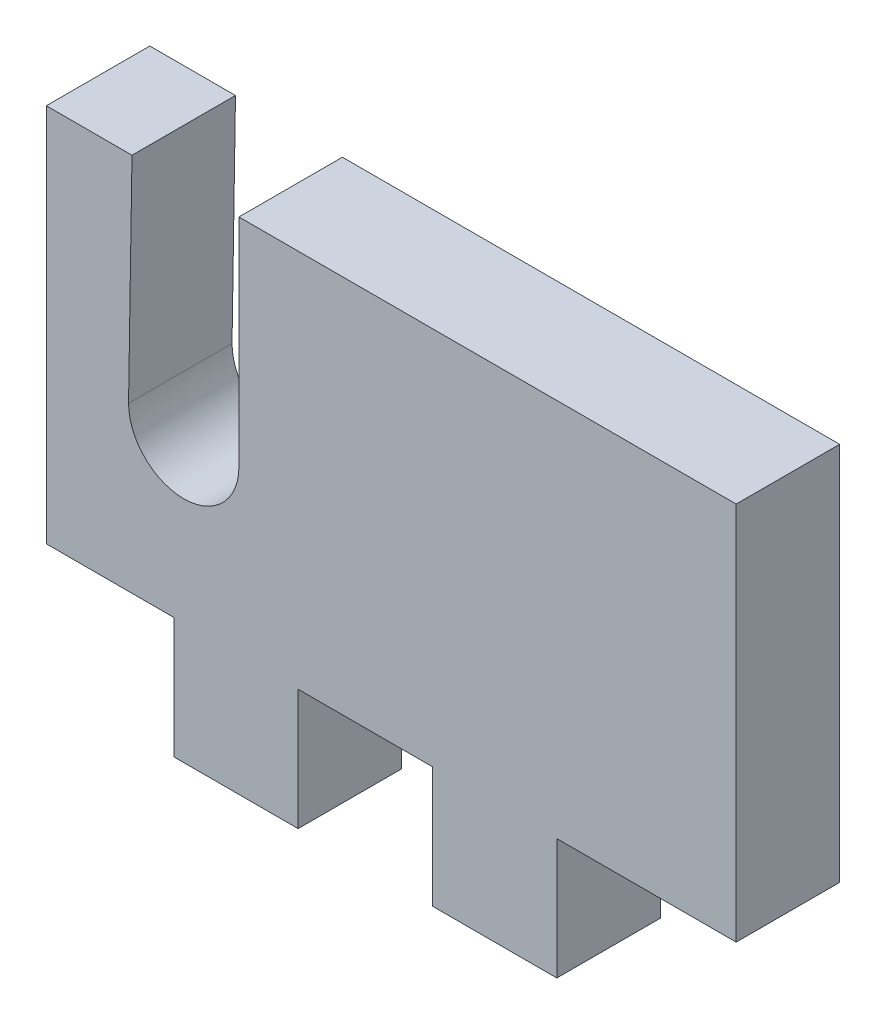
ISO-10303-21;
HEADER;
FILE_DESCRIPTION(('STEP AP214'),'2;1');
FILE_NAME('part.step','',(''),(''),'','','');
FILE_SCHEMA(('AUTOMOTIVE_DESIGN { 1 0 10303 214 1 1 1 1 }'));
ENDSEC;
DATA;
#1=APPLICATION_CONTEXT('core data for automotive mechanical design processes');
#2=APPLICATION_PROTOCOL_DEFINITION('international standard','automotive_design',2000,#1);
#3=PRODUCT_CONTEXT('',#1,'mechanical');
#4=PRODUCT('Part','Part','',(#3));
#5=PRODUCT_RELATED_PRODUCT_CATEGORY('part','',(#4));
#6=PRODUCT_DEFINITION_FORMATION('','',#4);
#7=PRODUCT_DEFINITION_CONTEXT('part definition',#1,'design');
#8=PRODUCT_DEFINITION('design','',#6,#7);
#9=PRODUCT_DEFINITION_SHAPE('','',#8);
#10=(LENGTH_UNIT() NAMED_UNIT(*) SI_UNIT(.MILLI.,.METRE.));
#11=(NAMED_UNIT(*) PLANE_ANGLE_UNIT() SI_UNIT($,.RADIAN.));
#12=(NAMED_UNIT(*) SI_UNIT($,.STERADIAN.) SOLID_ANGLE_UNIT());
#13=UNCERTAINTY_MEASURE_WITH_UNIT(LENGTH_MEASURE(1.E-05),#10,'distance_accuracy_value','');
#14=(GEOMETRIC_REPRESENTATION_CONTEXT(3) GLOBAL_UNCERTAINTY_ASSIGNED_CONTEXT((#13)) GLOBAL_UNIT_ASSIGNED_CONTEXT((#10,
#11,#12)) REPRESENTATION_CONTEXT('',''));
#15=CARTESIAN_POINT('',(0.,0.,0.));
#16=DIRECTION('',(0.,0.,1.));
#17=DIRECTION('',(1.,0.,0.));
#18=AXIS2_PLACEMENT_3D('',#15,#16,#17);
#19=CARTESIAN_POINT('',(-7.8838174273859,4.33402489626557,3.));
#20=DIRECTION('',(0.,-1.,0.));
#21=DIRECTION('',(0.,0.,-1.));
#22=AXIS2_PLACEMENT_3D('',#19,#20,#21);
#23=PLANE('',#22);
#24=DIRECTION('',(-1.,0.,0.));
#25=VECTOR('',#24,1.);
#26=CARTESIAN_POINT('',(-7.8838174273859,4.33402489626557,0.));
#27=LINE('',#26,#25);
#28=CARTESIAN_POINT('',(12.1161825726141,4.33402489626557,0.));
#29=VERTEX_POINT('',#28);
#30=CARTESIAN_POINT('',(-2.30010183619864,4.33402489626557,0.));
#31=VERTEX_POINT('',#30);
#32=EDGE_CURVE('E253',#29,#31,#27,.T.);
#33=ORIENTED_EDGE('',*,*,#32,.T.);
#34=DIRECTION('',(0.,0.,1.));
#35=VECTOR('',#34,1.);
#36=CARTESIAN_POINT('',(-2.30010183619864,4.33402489626557,0.));
#37=LINE('',#36,#35);
#38=CARTESIAN_POINT('',(-2.30010183619864,4.33402489626557,3.));
#39=VERTEX_POINT('',#38);
#40=EDGE_CURVE('E185',#31,#39,#37,.T.);
#41=ORIENTED_EDGE('',*,*,#40,.T.);
#42=DIRECTION('',(-1.,0.,0.));
#43=VECTOR('',#42,1.);
#44=CARTESIAN_POINT('',(-7.8838174273859,4.33402489626557,3.));
#45=LINE('',#44,#43);
#46=CARTESIAN_POINT('',(12.1161825726141,4.33402489626557,3.));
#47=VERTEX_POINT('',#46);
#48=EDGE_CURVE('E260',#47,#39,#45,.T.);
#49=ORIENTED_EDGE('',*,*,#48,.F.);
#50=DIRECTION('',(0.,0.,-1.));
#51=VECTOR('',#50,1.);
#52=CARTESIAN_POINT('',(12.1161825726141,4.33402489626557,3.));
#53=LINE('',#52,#51);
#54=EDGE_CURVE('E11',#47,#29,#53,.T.);
#55=ORIENTED_EDGE('',*,*,#54,.T.);
#56=EDGE_LOOP('',(#33,#41,#49,#55));
#57=FACE_BOUND('',#56,.T.);
#58=ADVANCED_FACE('F39',(#57),#23,.F.);
#59=CARTESIAN_POINT('',(-7.8838174273859,-10.1659751037344,3.));
#60=DIRECTION('',(0.,1.,0.));
#61=DIRECTION('',(0.,0.,1.));
#62=AXIS2_PLACEMENT_3D('',#59,#60,#61);
#63=PLANE('',#62);
#64=DIRECTION('',(1.,0.,0.));
#65=VECTOR('',#64,1.);
#66=CARTESIAN_POINT('',(-7.8838174273859,-10.1659751037344,3.));
#67=LINE('',#66,#65);
#68=CARTESIAN_POINT('',(-4.1838174273859,-10.1659751037344,3.));
#69=VERTEX_POINT('',#68);
#70=CARTESIAN_POINT('',(-0.583817427385895,-10.1659751037344,3.));
#71=VERTEX_POINT('',#70);
#72=EDGE_CURVE('E256',#69,#71,#67,.T.);
#73=ORIENTED_EDGE('',*,*,#72,.F.);
#74=DIRECTION('',(0.,0.,1.));
#75=VECTOR('',#74,1.);
#76=CARTESIAN_POINT('',(-4.1838174273859,-10.1659751037344,0.));
#77=LINE('',#76,#75);
#78=CARTESIAN_POINT('',(-4.1838174273859,-10.1659751037344,0.));
#79=VERTEX_POINT('',#78);
#80=EDGE_CURVE('E196',#79,#69,#77,.T.);
#81=ORIENTED_EDGE('',*,*,#80,.F.);
#82=DIRECTION('',(1.,0.,0.));
#83=VECTOR('',#82,1.);
#84=CARTESIAN_POINT('',(-7.8838174273859,-10.1659751037344,0.));
#85=LINE('',#84,#83);
#86=CARTESIAN_POINT('',(-0.583817427385895,-10.1659751037344,0.));
#87=VERTEX_POINT('',#86);
#88=EDGE_CURVE('E268',#79,#87,#85,.T.);
#89=ORIENTED_EDGE('',*,*,#88,.T.);
#90=DIRECTION('',(0.,0.,1.));
#91=VECTOR('',#90,1.);
#92=CARTESIAN_POINT('',(-0.583817427385895,-10.1659751037344,0.));
#93=LINE('',#92,#91);
#94=EDGE_CURVE('E209',#87,#71,#93,.T.);
#95=ORIENTED_EDGE('',*,*,#94,.T.);
#96=EDGE_LOOP('',(#73,#81,#89,#95));
#97=FACE_BOUND('',#96,.T.);
#98=ADVANCED_FACE('F286',(#97),#63,.F.);
#99=CARTESIAN_POINT('',(-7.8838174273859,4.33402489626557,3.));
#100=DIRECTION('',(1.,0.,0.));
#101=DIRECTION('',(0.,1.,0.));
#102=AXIS2_PLACEMENT_3D('',#99,#100,#101);
#103=PLANE('',#102);
#104=DIRECTION('',(0.,-1.,0.));
#105=VECTOR('',#104,1.);
#106=CARTESIAN_POINT('',(-7.8838174273859,4.33402489626557,0.));
#107=LINE('',#106,#105);
#108=CARTESIAN_POINT('',(-7.8838174273859,4.33402489626557,0.));
#109=VERTEX_POINT('',#108);
#110=CARTESIAN_POINT('',(-7.8838174273859,-6.66597510373444,0.));
#111=VERTEX_POINT('',#110);
#112=EDGE_CURVE('E205',#109,#111,#107,.T.);
#113=ORIENTED_EDGE('',*,*,#112,.T.);
#114=DIRECTION('',(0.,0.,1.));
#115=VECTOR('',#114,1.);
#116=CARTESIAN_POINT('',(-7.8838174273859,-6.66597510373444,0.));
#117=LINE('',#116,#115);
#118=CARTESIAN_POINT('',(-7.8838174273859,-6.66597510373444,3.));
#119=VERTEX_POINT('',#118);
#120=EDGE_CURVE('E202',#111,#119,#117,.T.);
#121=ORIENTED_EDGE('',*,*,#120,.T.);
#122=DIRECTION('',(0.,-1.,0.));
#123=VECTOR('',#122,1.);
#124=CARTESIAN_POINT('',(-7.8838174273859,4.33402489626557,3.));
#125=LINE('',#124,#123);
#126=CARTESIAN_POINT('',(-7.8838174273859,4.33402489626557,3.));
#127=VERTEX_POINT('',#126);
#128=EDGE_CURVE('E249',#127,#119,#125,.T.);
#129=ORIENTED_EDGE('',*,*,#128,.F.);
#130=DIRECTION('',(0.,0.,-1.));
#131=VECTOR('',#130,1.);
#132=CARTESIAN_POINT('',(-7.8838174273859,4.33402489626557,3.));
#133=LINE('',#132,#131);
#134=EDGE_CURVE('E47',#127,#109,#133,.T.);
#135=ORIENTED_EDGE('',*,*,#134,.T.);
#136=EDGE_LOOP('',(#113,#121,#129,#135));
#137=FACE_BOUND('',#136,.T.);
#138=ADVANCED_FACE('F41',(#137),#103,.F.);
#139=CARTESIAN_POINT('',(3.3161825726141,-10.1659751037344,3.));
#140=VERTEX_POINT('',#139);
#141=CARTESIAN_POINT('',(6.9161825726141,-10.1659751037344,3.));
#142=VERTEX_POINT('',#141);
#143=EDGE_CURVE('E252',#140,#142,#67,.T.);
#144=ORIENTED_EDGE('',*,*,#143,.F.);
#145=DIRECTION('',(0.,0.,1.));
#146=VECTOR('',#145,1.);
#147=CARTESIAN_POINT('',(3.3161825726141,-10.1659751037344,0.));
#148=LINE('',#147,#146);
#149=CARTESIAN_POINT('',(3.3161825726141,-10.1659751037344,0.));
#150=VERTEX_POINT('',#149);
#151=EDGE_CURVE('E212',#150,#140,#148,.T.);
#152=ORIENTED_EDGE('',*,*,#151,.F.);
#153=CARTESIAN_POINT('',(6.9161825726141,-10.1659751037344,0.));
#154=VERTEX_POINT('',#153);
#155=EDGE_CURVE('E265',#150,#154,#85,.T.);
#156=ORIENTED_EDGE('',*,*,#155,.T.);
#157=DIRECTION('',(0.,0.,1.));
#158=VECTOR('',#157,1.);
#159=CARTESIAN_POINT('',(6.9161825726141,-10.1659751037344,0.));
#160=LINE('',#159,#158);
#161=EDGE_CURVE('E233',#154,#142,#160,.T.);
#162=ORIENTED_EDGE('',*,*,#161,.T.);
#163=EDGE_LOOP('',(#144,#152,#156,#162));
#164=FACE_BOUND('',#163,.T.);
#165=ADVANCED_FACE('F314',(#164),#63,.F.);
#166=CARTESIAN_POINT('',(12.1161825726141,4.33402489626557,3.));
#167=DIRECTION('',(-1.,0.,0.));
#168=DIRECTION('',(0.,-1.,0.));
#169=AXIS2_PLACEMENT_3D('',#166,#167,#168);
#170=PLANE('',#169);
#171=DIRECTION('',(0.,1.,0.));
#172=VECTOR('',#171,1.);
#173=CARTESIAN_POINT('',(12.1161825726141,4.33402489626557,3.));
#174=LINE('',#173,#172);
#175=CARTESIAN_POINT('',(12.1161825726141,-6.66597510373444,3.));
#176=VERTEX_POINT('',#175);
#177=EDGE_CURVE('E257',#176,#47,#174,.T.);
#178=ORIENTED_EDGE('',*,*,#177,.F.);
#179=DIRECTION('',(0.,0.,1.));
#180=VECTOR('',#179,1.);
#181=CARTESIAN_POINT('',(12.1161825726141,-6.66597510373444,0.));
#182=LINE('',#181,#180);
#183=CARTESIAN_POINT('',(12.1161825726141,-6.66597510373444,0.));
#184=VERTEX_POINT('',#183);
#185=EDGE_CURVE('E237',#184,#176,#182,.T.);
#186=ORIENTED_EDGE('',*,*,#185,.F.);
#187=DIRECTION('',(0.,1.,0.));
#188=VECTOR('',#187,1.);
#189=CARTESIAN_POINT('',(12.1161825726141,4.33402489626557,0.));
#190=LINE('',#189,#188);
#191=EDGE_CURVE('E269',#184,#29,#190,.T.);
#192=ORIENTED_EDGE('',*,*,#191,.T.);
#193=ORIENTED_EDGE('',*,*,#54,.F.);
#194=EDGE_LOOP('',(#178,#186,#192,#193));
#195=FACE_BOUND('',#194,.T.);
#196=ADVANCED_FACE('F318',(#195),#170,.F.);
#197=CARTESIAN_POINT('',(-5.40010183619864,4.33402489626557,3.));
#198=VERTEX_POINT('',#197);
#199=EDGE_CURVE('E259',#198,#127,#45,.T.);
#200=ORIENTED_EDGE('',*,*,#199,.F.);
#201=DIRECTION('',(0.,0.,1.));
#202=VECTOR('',#201,1.);
#203=CARTESIAN_POINT('',(-5.40010183619864,4.33402489626557,0.));
#204=LINE('',#203,#202);
#205=CARTESIAN_POINT('',(-5.40010183619864,4.33402489626557,0.));
#206=VERTEX_POINT('',#205);
#207=EDGE_CURVE('E183',#206,#198,#204,.T.);
#208=ORIENTED_EDGE('',*,*,#207,.F.);
#209=EDGE_CURVE('E175',#206,#109,#27,.T.);
#210=ORIENTED_EDGE('',*,*,#209,.T.);
#211=ORIENTED_EDGE('',*,*,#134,.F.);
#212=EDGE_LOOP('',(#200,#208,#210,#211));
#213=FACE_BOUND('',#212,.T.);
#214=ADVANCED_FACE('F310',(#213),#23,.F.);
#215=CARTESIAN_POINT('',(0.,0.,3.));
#216=DIRECTION('',(0.,0.,1.));
#217=DIRECTION('',(1.,0.,0.));
#218=AXIS2_PLACEMENT_3D('',#215,#216,#217);
#219=PLANE('',#218);
#220=CARTESIAN_POINT('',(-3.90010183619864,-1.9416604081488,3.));
#221=DIRECTION('',(0.,0.,1.));
#222=DIRECTION('',(1.,0.,0.));
#223=AXIS2_PLACEMENT_3D('',#220,#221,#222);
#224=CIRCLE('',#223,1.60000378724346);
#225=CARTESIAN_POINT('',(-5.50010183619864,-1.94514167134186,3.));
#226=VERTEX_POINT('',#225);
#227=CARTESIAN_POINT('',(-2.30010183619864,-1.93817914495575,3.));
#228=VERTEX_POINT('',#227);
#229=EDGE_CURVE('E176',#226,#228,#224,.T.);
#230=ORIENTED_EDGE('',*,*,#229,.F.);
#231=DIRECTION('',(-0.015923661200951,-0.999873210469186,0.));
#232=VECTOR('',#231,1.);
#233=CARTESIAN_POINT('',(-5.40010183619864,4.33402489626557,3.));
#234=LINE('',#233,#232);
#235=EDGE_CURVE('E158',#198,#226,#234,.T.);
#236=ORIENTED_EDGE('',*,*,#235,.F.);
#237=ORIENTED_EDGE('',*,*,#199,.T.);
#238=ORIENTED_EDGE('',*,*,#128,.T.);
#239=DIRECTION('',(-1.,0.,0.));
#240=VECTOR('',#239,1.);
#241=CARTESIAN_POINT('',(-7.8838174273859,-6.66597510373444,3.));
#242=LINE('',#241,#240);
#243=CARTESIAN_POINT('',(-4.1838174273859,-6.66597510373444,3.));
#244=VERTEX_POINT('',#243);
#245=EDGE_CURVE('E194',#244,#119,#242,.T.);
#246=ORIENTED_EDGE('',*,*,#245,.F.);
#247=DIRECTION('',(0.,1.,0.));
#248=VECTOR('',#247,1.);
#249=CARTESIAN_POINT('',(-4.1838174273859,-10.1659751037344,3.));
#250=LINE('',#249,#248);
#251=EDGE_CURVE('E197',#69,#244,#250,.T.);
#252=ORIENTED_EDGE('',*,*,#251,.F.);
#253=ORIENTED_EDGE('',*,*,#72,.T.);
#254=DIRECTION('',(0.,-1.,0.));
#255=VECTOR('',#254,1.);
#256=CARTESIAN_POINT('',(-0.583817427385895,-10.1659751037344,3.));
#257=LINE('',#256,#255);
#258=CARTESIAN_POINT('',(-0.583817427385895,-6.66597510373444,3.));
#259=VERTEX_POINT('',#258);
#260=EDGE_CURVE('E200',#259,#71,#257,.T.);
#261=ORIENTED_EDGE('',*,*,#260,.F.);
#262=DIRECTION('',(-1.,0.,0.));
#263=VECTOR('',#262,1.);
#264=CARTESIAN_POINT('',(-0.583817427385895,-6.66597510373444,3.));
#265=LINE('',#264,#263);
#266=CARTESIAN_POINT('',(3.3161825726141,-6.66597510373444,3.));
#267=VERTEX_POINT('',#266);
#268=EDGE_CURVE('E219',#267,#259,#265,.T.);
#269=ORIENTED_EDGE('',*,*,#268,.F.);
#270=DIRECTION('',(0.,1.,0.));
#271=VECTOR('',#270,1.);
#272=CARTESIAN_POINT('',(3.3161825726141,-10.1659751037344,3.));
#273=LINE('',#272,#271);
#274=EDGE_CURVE('E222',#140,#267,#273,.T.);
#275=ORIENTED_EDGE('',*,*,#274,.F.);
#276=ORIENTED_EDGE('',*,*,#143,.T.);
#277=DIRECTION('',(0.,-1.,0.));
#278=VECTOR('',#277,1.);
#279=CARTESIAN_POINT('',(6.9161825726141,-10.1659751037344,3.));
#280=LINE('',#279,#278);
#281=CARTESIAN_POINT('',(6.9161825726141,-6.66597510373444,3.));
#282=VERTEX_POINT('',#281);
#283=EDGE_CURVE('E218',#282,#142,#280,.T.);
#284=ORIENTED_EDGE('',*,*,#283,.F.);
#285=DIRECTION('',(-1.,0.,0.));
#286=VECTOR('',#285,1.);
#287=CARTESIAN_POINT('',(6.9161825726141,-6.66597510373444,3.));
#288=LINE('',#287,#286);
#289=EDGE_CURVE('E240',#176,#282,#288,.T.);
#290=ORIENTED_EDGE('',*,*,#289,.F.);
#291=ORIENTED_EDGE('',*,*,#177,.T.);
#292=ORIENTED_EDGE('',*,*,#48,.T.);
#293=DIRECTION('',(0.,1.,0.));
#294=VECTOR('',#293,1.);
#295=CARTESIAN_POINT('',(-2.30010183619864,4.33402489626557,3.));
#296=LINE('',#295,#294);
#297=EDGE_CURVE('E161',#228,#39,#296,.T.);
#298=ORIENTED_EDGE('',*,*,#297,.F.);
#299=EDGE_LOOP('',(#230,#236,#237,#238,#246,#252,#253,#261,#269,#275,#276,#284,#290,#291,#292,#298));
#300=FACE_BOUND('',#299,.T.);
#301=ADVANCED_FACE('F290',(#300),#219,.T.);
#302=CARTESIAN_POINT('',(0.,0.,0.));
#303=DIRECTION('',(0.,0.,1.));
#304=DIRECTION('',(1.,0.,0.));
#305=AXIS2_PLACEMENT_3D('',#302,#303,#304);
#306=PLANE('',#305);
#307=DIRECTION('',(-0.015923661200951,-0.999873210469186,0.));
#308=VECTOR('',#307,1.);
#309=CARTESIAN_POINT('',(-5.40010183619864,4.33402489626557,0.));
#310=LINE('',#309,#308);
#311=CARTESIAN_POINT('',(-5.50010183619864,-1.94514167134186,0.));
#312=VERTEX_POINT('',#311);
#313=EDGE_CURVE('E155',#206,#312,#310,.T.);
#314=ORIENTED_EDGE('',*,*,#313,.T.);
#315=CARTESIAN_POINT('',(-3.90010183619864,-1.9416604081488,0.));
#316=DIRECTION('',(0.,0.,1.));
#317=DIRECTION('',(1.,0.,0.));
#318=AXIS2_PLACEMENT_3D('',#315,#316,#317);
#319=CIRCLE('',#318,1.60000378724346);
#320=CARTESIAN_POINT('',(-2.30010183619864,-1.93817914495575,0.));
#321=VERTEX_POINT('',#320);
#322=EDGE_CURVE('E162',#312,#321,#319,.T.);
#323=ORIENTED_EDGE('',*,*,#322,.T.);
#324=DIRECTION('',(0.,1.,0.));
#325=VECTOR('',#324,1.);
#326=CARTESIAN_POINT('',(-2.30010183619864,4.33402489626557,0.));
#327=LINE('',#326,#325);
#328=EDGE_CURVE('E181',#321,#31,#327,.T.);
#329=ORIENTED_EDGE('',*,*,#328,.T.);
#330=ORIENTED_EDGE('',*,*,#32,.F.);
#331=ORIENTED_EDGE('',*,*,#191,.F.);
#332=DIRECTION('',(-1.,0.,0.));
#333=VECTOR('',#332,1.);
#334=CARTESIAN_POINT('',(6.9161825726141,-6.66597510373444,0.));
#335=LINE('',#334,#333);
#336=CARTESIAN_POINT('',(6.9161825726141,-6.66597510373444,0.));
#337=VERTEX_POINT('',#336);
#338=EDGE_CURVE('E236',#184,#337,#335,.T.);
#339=ORIENTED_EDGE('',*,*,#338,.T.);
#340=DIRECTION('',(0.,-1.,0.));
#341=VECTOR('',#340,1.);
#342=CARTESIAN_POINT('',(6.9161825726141,-10.1659751037344,0.));
#343=LINE('',#342,#341);
#344=EDGE_CURVE('E243',#337,#154,#343,.T.);
#345=ORIENTED_EDGE('',*,*,#344,.T.);
#346=ORIENTED_EDGE('',*,*,#155,.F.);
#347=DIRECTION('',(0.,1.,0.));
#348=VECTOR('',#347,1.);
#349=CARTESIAN_POINT('',(3.3161825726141,-10.1659751037344,0.));
#350=LINE('',#349,#348);
#351=CARTESIAN_POINT('',(3.3161825726141,-6.66597510373444,0.));
#352=VERTEX_POINT('',#351);
#353=EDGE_CURVE('E228',#150,#352,#350,.T.);
#354=ORIENTED_EDGE('',*,*,#353,.T.);
#355=DIRECTION('',(-1.,0.,0.));
#356=VECTOR('',#355,1.);
#357=CARTESIAN_POINT('',(-0.583817427385895,-6.66597510373444,0.));
#358=LINE('',#357,#356);
#359=CARTESIAN_POINT('',(-0.583817427385895,-6.66597510373444,0.));
#360=VERTEX_POINT('',#359);
#361=EDGE_CURVE('E62',#352,#360,#358,.T.);
#362=ORIENTED_EDGE('',*,*,#361,.T.);
#363=DIRECTION('',(0.,-1.,0.));
#364=VECTOR('',#363,1.);
#365=CARTESIAN_POINT('',(-0.583817427385895,-10.1659751037344,0.));
#366=LINE('',#365,#364);
#367=EDGE_CURVE('E223',#360,#87,#366,.T.);
#368=ORIENTED_EDGE('',*,*,#367,.T.);
#369=ORIENTED_EDGE('',*,*,#88,.F.);
#370=DIRECTION('',(0.,1.,0.));
#371=VECTOR('',#370,1.);
#372=CARTESIAN_POINT('',(-4.1838174273859,-10.1659751037344,0.));
#373=LINE('',#372,#371);
#374=CARTESIAN_POINT('',(-4.1838174273859,-6.66597510373444,0.));
#375=VERTEX_POINT('',#374);
#376=EDGE_CURVE('E191',#79,#375,#373,.T.);
#377=ORIENTED_EDGE('',*,*,#376,.T.);
#378=DIRECTION('',(-1.,0.,0.));
#379=VECTOR('',#378,1.);
#380=CARTESIAN_POINT('',(-7.8838174273859,-6.66597510373444,0.));
#381=LINE('',#380,#379);
#382=EDGE_CURVE('E54',#375,#111,#381,.T.);
#383=ORIENTED_EDGE('',*,*,#382,.T.);
#384=ORIENTED_EDGE('',*,*,#112,.F.);
#385=ORIENTED_EDGE('',*,*,#209,.F.);
#386=EDGE_LOOP('',(#314,#323,#329,#330,#331,#339,#345,#346,#354,#362,#368,#369,#377,#383,#384,#385));
#387=FACE_BOUND('',#386,.T.);
#388=ADVANCED_FACE('F173',(#387),#306,.F.);
#389=CARTESIAN_POINT('',(6.9161825726141,-10.1659751037344,0.));
#390=DIRECTION('',(-1.,0.,0.));
#391=DIRECTION('',(0.,0.,1.));
#392=AXIS2_PLACEMENT_3D('',#389,#390,#391);
#393=PLANE('',#392);
#394=ORIENTED_EDGE('',*,*,#283,.T.);
#395=ORIENTED_EDGE('',*,*,#161,.F.);
#396=ORIENTED_EDGE('',*,*,#344,.F.);
#397=DIRECTION('',(0.,0.,1.));
#398=VECTOR('',#397,1.);
#399=CARTESIAN_POINT('',(6.9161825726141,-6.66597510373444,0.));
#400=LINE('',#399,#398);
#401=EDGE_CURVE('E188',#337,#282,#400,.T.);
#402=ORIENTED_EDGE('',*,*,#401,.T.);
#403=EDGE_LOOP('',(#394,#395,#396,#402));
#404=FACE_BOUND('',#403,.T.);
#405=ADVANCED_FACE('F340',(#404),#393,.F.);
#406=CARTESIAN_POINT('',(6.9161825726141,-6.66597510373444,0.));
#407=DIRECTION('',(0.,1.,0.));
#408=DIRECTION('',(0.,0.,1.));
#409=AXIS2_PLACEMENT_3D('',#406,#407,#408);
#410=PLANE('',#409);
#411=ORIENTED_EDGE('',*,*,#289,.T.);
#412=ORIENTED_EDGE('',*,*,#401,.F.);
#413=ORIENTED_EDGE('',*,*,#338,.F.);
#414=ORIENTED_EDGE('',*,*,#185,.T.);
#415=EDGE_LOOP('',(#411,#412,#413,#414));
#416=FACE_BOUND('',#415,.T.);
#417=ADVANCED_FACE('F336',(#416),#410,.F.);
#418=CARTESIAN_POINT('',(-0.583817427385895,-10.1659751037344,0.));
#419=DIRECTION('',(-1.,0.,0.));
#420=DIRECTION('',(0.,0.,1.));
#421=AXIS2_PLACEMENT_3D('',#418,#419,#420);
#422=PLANE('',#421);
#423=ORIENTED_EDGE('',*,*,#260,.T.);
#424=ORIENTED_EDGE('',*,*,#94,.F.);
#425=ORIENTED_EDGE('',*,*,#367,.F.);
#426=DIRECTION('',(0.,0.,1.));
#427=VECTOR('',#426,1.);
#428=CARTESIAN_POINT('',(-0.583817427385895,-6.66597510373444,0.));
#429=LINE('',#428,#427);
#430=EDGE_CURVE('E216',#360,#259,#429,.T.);
#431=ORIENTED_EDGE('',*,*,#430,.T.);
#432=EDGE_LOOP('',(#423,#424,#425,#431));
#433=FACE_BOUND('',#432,.T.);
#434=ADVANCED_FACE('F347',(#433),#422,.F.);
#435=CARTESIAN_POINT('',(-0.583817427385895,-6.66597510373444,0.));
#436=DIRECTION('',(0.,1.,0.));
#437=DIRECTION('',(0.,0.,1.));
#438=AXIS2_PLACEMENT_3D('',#435,#436,#437);
#439=PLANE('',#438);
#440=ORIENTED_EDGE('',*,*,#268,.T.);
#441=ORIENTED_EDGE('',*,*,#430,.F.);
#442=ORIENTED_EDGE('',*,*,#361,.F.);
#443=DIRECTION('',(0.,0.,1.));
#444=VECTOR('',#443,1.);
#445=CARTESIAN_POINT('',(3.3161825726141,-6.66597510373444,0.));
#446=LINE('',#445,#444);
#447=EDGE_CURVE('E214',#352,#267,#446,.T.);
#448=ORIENTED_EDGE('',*,*,#447,.T.);
#449=EDGE_LOOP('',(#440,#441,#442,#448));
#450=FACE_BOUND('',#449,.T.);
#451=ADVANCED_FACE('F303',(#450),#439,.F.);
#452=CARTESIAN_POINT('',(3.3161825726141,-10.1659751037344,0.));
#453=DIRECTION('',(1.,0.,0.));
#454=DIRECTION('',(0.,0.,-1.));
#455=AXIS2_PLACEMENT_3D('',#452,#453,#454);
#456=PLANE('',#455);
#457=ORIENTED_EDGE('',*,*,#274,.T.);
#458=ORIENTED_EDGE('',*,*,#447,.F.);
#459=ORIENTED_EDGE('',*,*,#353,.F.);
#460=ORIENTED_EDGE('',*,*,#151,.T.);
#461=EDGE_LOOP('',(#457,#458,#459,#460));
#462=FACE_BOUND('',#461,.T.);
#463=ADVANCED_FACE('F295',(#462),#456,.F.);
#464=CARTESIAN_POINT('',(-7.8838174273859,-6.66597510373444,0.));
#465=DIRECTION('',(0.,1.,0.));
#466=DIRECTION('',(0.,0.,1.));
#467=AXIS2_PLACEMENT_3D('',#464,#465,#466);
#468=PLANE('',#467);
#469=ORIENTED_EDGE('',*,*,#245,.T.);
#470=ORIENTED_EDGE('',*,*,#120,.F.);
#471=ORIENTED_EDGE('',*,*,#382,.F.);
#472=DIRECTION('',(0.,0.,1.));
#473=VECTOR('',#472,1.);
#474=CARTESIAN_POINT('',(-4.1838174273859,-6.66597510373444,0.));
#475=LINE('',#474,#473);
#476=EDGE_CURVE('E206',#375,#244,#475,.T.);
#477=ORIENTED_EDGE('',*,*,#476,.T.);
#478=EDGE_LOOP('',(#469,#470,#471,#477));
#479=FACE_BOUND('',#478,.T.);
#480=ADVANCED_FACE('F293',(#479),#468,.F.);
#481=CARTESIAN_POINT('',(-4.1838174273859,-10.1659751037344,0.));
#482=DIRECTION('',(1.,0.,0.));
#483=DIRECTION('',(0.,0.,-1.));
#484=AXIS2_PLACEMENT_3D('',#481,#482,#483);
#485=PLANE('',#484);
#486=ORIENTED_EDGE('',*,*,#251,.T.);
#487=ORIENTED_EDGE('',*,*,#476,.F.);
#488=ORIENTED_EDGE('',*,*,#376,.F.);
#489=ORIENTED_EDGE('',*,*,#80,.T.);
#490=EDGE_LOOP('',(#486,#487,#488,#489));
#491=FACE_BOUND('',#490,.T.);
#492=ADVANCED_FACE('F282',(#491),#485,.F.);
#493=CARTESIAN_POINT('',(-2.30010183619864,4.33402489626557,0.));
#494=DIRECTION('',(1.,0.,0.));
#495=DIRECTION('',(0.,1.,0.));
#496=AXIS2_PLACEMENT_3D('',#493,#494,#495);
#497=PLANE('',#496);
#498=ORIENTED_EDGE('',*,*,#297,.T.);
#499=ORIENTED_EDGE('',*,*,#40,.F.);
#500=ORIENTED_EDGE('',*,*,#328,.F.);
#501=DIRECTION('',(0.,0.,1.));
#502=VECTOR('',#501,1.);
#503=CARTESIAN_POINT('',(-2.30010183619864,-1.93817914495575,0.));
#504=LINE('',#503,#502);
#505=EDGE_CURVE('E167',#321,#228,#504,.T.);
#506=ORIENTED_EDGE('',*,*,#505,.T.);
#507=EDGE_LOOP('',(#498,#499,#500,#506));
#508=FACE_BOUND('',#507,.T.);
#509=ADVANCED_FACE('F301',(#508),#497,.F.);
#510=CARTESIAN_POINT('',(-3.90010183619864,-1.9416604081488,0.));
#511=DIRECTION('',(0.,0.,1.));
#512=DIRECTION('',(1.,0.,0.));
#513=AXIS2_PLACEMENT_3D('',#510,#511,#512);
#514=CYLINDRICAL_SURFACE('',#513,1.60000378724346);
#515=ORIENTED_EDGE('',*,*,#229,.T.);
#516=ORIENTED_EDGE('',*,*,#505,.F.);
#517=ORIENTED_EDGE('',*,*,#322,.F.);
#518=DIRECTION('',(0.,0.,1.));
#519=VECTOR('',#518,1.);
#520=CARTESIAN_POINT('',(-5.50010183619864,-1.94514167134186,0.));
#521=LINE('',#520,#519);
#522=EDGE_CURVE('E151',#312,#226,#521,.T.);
#523=ORIENTED_EDGE('',*,*,#522,.T.);
#524=EDGE_LOOP('',(#515,#516,#517,#523));
#525=FACE_BOUND('',#524,.T.);
#526=ADVANCED_FACE('F165',(#525),#514,.F.);
#527=CARTESIAN_POINT('',(-5.40010183619864,4.33402489626557,0.));
#528=DIRECTION('',(-0.999873210469186,0.015923661200951,0.));
#529=DIRECTION('',(-0.015923661200951,-0.999873210469186,0.));
#530=AXIS2_PLACEMENT_3D('',#527,#528,#529);
#531=PLANE('',#530);
#532=ORIENTED_EDGE('',*,*,#235,.T.);
#533=ORIENTED_EDGE('',*,*,#522,.F.);
#534=ORIENTED_EDGE('',*,*,#313,.F.);
#535=ORIENTED_EDGE('',*,*,#207,.T.);
#536=EDGE_LOOP('',(#532,#533,#534,#535));
#537=FACE_BOUND('',#536,.T.);
#538=ADVANCED_FACE('F153',(#537),#531,.F.);
#539=CLOSED_SHELL('',(#58,#98,#138,#165,#196,#214,#301,#388,#405,#417,#434,#451,#463,#480,#492,
#509,#526,#538));
#540=MANIFOLD_SOLID_BREP('B2',#539);
#541=ADVANCED_BREP_SHAPE_REPRESENTATION('',(#18,#540),#14);
#542=SHAPE_DEFINITION_REPRESENTATION(#9,#541);
ENDSEC;
END-ISO-10303-21;
